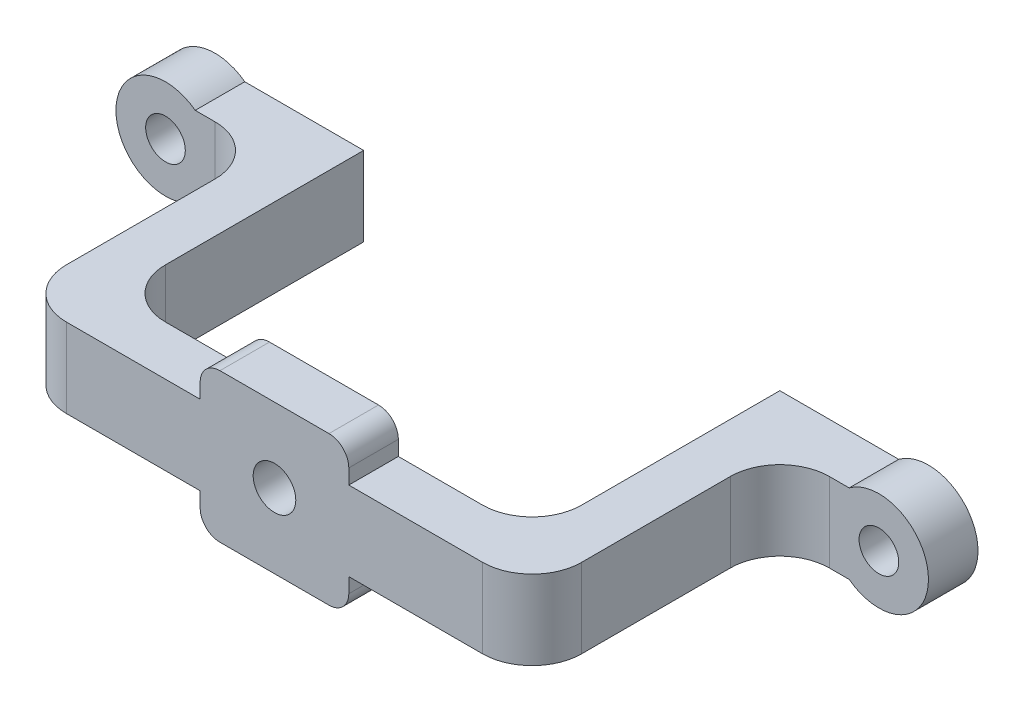
ISO-10303-21;
HEADER;
FILE_DESCRIPTION(('STEP AP214'),'2;1');
FILE_NAME('part.step','',(''),(''),'','','');
FILE_SCHEMA(('AUTOMOTIVE_DESIGN { 1 0 10303 214 1 1 1 1 }'));
ENDSEC;
DATA;
#1=APPLICATION_CONTEXT('core data for automotive mechanical design processes');
#2=APPLICATION_PROTOCOL_DEFINITION('international standard','automotive_design',2000,#1);
#3=PRODUCT_CONTEXT('',#1,'mechanical');
#4=PRODUCT('Part','Part','',(#3));
#5=PRODUCT_RELATED_PRODUCT_CATEGORY('part','',(#4));
#6=PRODUCT_DEFINITION_FORMATION('','',#4);
#7=PRODUCT_DEFINITION_CONTEXT('part definition',#1,'design');
#8=PRODUCT_DEFINITION('design','',#6,#7);
#9=PRODUCT_DEFINITION_SHAPE('','',#8);
#10=(LENGTH_UNIT() NAMED_UNIT(*) SI_UNIT(.MILLI.,.METRE.));
#11=(NAMED_UNIT(*) PLANE_ANGLE_UNIT() SI_UNIT($,.RADIAN.));
#12=(NAMED_UNIT(*) SI_UNIT($,.STERADIAN.) SOLID_ANGLE_UNIT());
#13=UNCERTAINTY_MEASURE_WITH_UNIT(LENGTH_MEASURE(1.E-05),#10,'distance_accuracy_value','');
#14=(GEOMETRIC_REPRESENTATION_CONTEXT(3) GLOBAL_UNCERTAINTY_ASSIGNED_CONTEXT((#13)) GLOBAL_UNIT_ASSIGNED_CONTEXT((#10,
#11,#12)) REPRESENTATION_CONTEXT('',''));
#15=CARTESIAN_POINT('',(0.,0.,0.));
#16=DIRECTION('',(0.,0.,1.));
#17=DIRECTION('',(1.,0.,0.));
#18=AXIS2_PLACEMENT_3D('',#15,#16,#17);
#19=CARTESIAN_POINT('',(15.,4.,0.));
#20=DIRECTION('',(0.,-1.,0.));
#21=DIRECTION('',(0.,0.,-1.));
#22=AXIS2_PLACEMENT_3D('',#19,#20,#21);
#23=PLANE('',#22);
#24=DIRECTION('',(0.,0.,-1.));
#25=VECTOR('',#24,1.);
#26=CARTESIAN_POINT('',(10.,4.,30.));
#27=LINE('',#26,#25);
#28=CARTESIAN_POINT('',(10.,4.,25.));
#29=VERTEX_POINT('',#28);
#30=CARTESIAN_POINT('',(10.,4.,10.));
#31=VERTEX_POINT('',#30);
#32=EDGE_CURVE('E326',#29,#31,#27,.T.);
#33=ORIENTED_EDGE('',*,*,#32,.F.);
#34=CARTESIAN_POINT('',(15.,3.99999999999999,25.));
#35=DIRECTION('',(0.,-1.,0.));
#36=DIRECTION('',(0.,0.,-1.));
#37=AXIS2_PLACEMENT_3D('',#34,#35,#36);
#38=CIRCLE('',#37,5.);
#39=CARTESIAN_POINT('',(15.,4.,30.));
#40=VERTEX_POINT('',#39);
#41=EDGE_CURVE('E429',#29,#40,#38,.F.);
#42=ORIENTED_EDGE('',*,*,#41,.T.);
#43=DIRECTION('',(-1.,0.,0.));
#44=VECTOR('',#43,1.);
#45=CARTESIAN_POINT('',(15.,4.,30.));
#46=LINE('',#45,#44);
#47=CARTESIAN_POINT('',(28.5,4.,30.));
#48=VERTEX_POINT('',#47);
#49=EDGE_CURVE('E242',#48,#40,#46,.T.);
#50=ORIENTED_EDGE('',*,*,#49,.F.);
#51=DIRECTION('',(0.,0.,-1.));
#52=VECTOR('',#51,1.);
#53=CARTESIAN_POINT('',(28.5,4.,0.));
#54=LINE('',#53,#52);
#55=CARTESIAN_POINT('',(28.5,4.,25.));
#56=VERTEX_POINT('',#55);
#57=EDGE_CURVE('E273',#48,#56,#54,.T.);
#58=ORIENTED_EDGE('',*,*,#57,.T.);
#59=DIRECTION('',(-1.,0.,0.));
#60=VECTOR('',#59,1.);
#61=CARTESIAN_POINT('',(36.,4.,25.));
#62=LINE('',#61,#60);
#63=CARTESIAN_POINT('',(20.,4.,25.));
#64=VERTEX_POINT('',#63);
#65=EDGE_CURVE('E312',#56,#64,#62,.T.);
#66=ORIENTED_EDGE('',*,*,#65,.T.);
#67=CARTESIAN_POINT('',(20.,3.99999999999999,20.));
#68=DIRECTION('',(0.,-1.,0.));
#69=DIRECTION('',(0.,0.,-1.));
#70=AXIS2_PLACEMENT_3D('',#67,#68,#69);
#71=CIRCLE('',#70,5.);
#72=CARTESIAN_POINT('',(15.,3.99999999999999,20.));
#73=VERTEX_POINT('',#72);
#74=EDGE_CURVE('E44',#64,#73,#71,.T.);
#75=ORIENTED_EDGE('',*,*,#74,.T.);
#76=DIRECTION('',(0.,0.,1.));
#77=VECTOR('',#76,1.);
#78=CARTESIAN_POINT('',(15.,4.,0.));
#79=LINE('',#78,#77);
#80=CARTESIAN_POINT('',(15.,4.,0.));
#81=VERTEX_POINT('',#80);
#82=EDGE_CURVE('E336',#81,#73,#79,.T.);
#83=ORIENTED_EDGE('',*,*,#82,.F.);
#84=DIRECTION('',(-1.,0.,0.));
#85=VECTOR('',#84,1.);
#86=CARTESIAN_POINT('',(15.,4.,0.));
#87=LINE('',#86,#85);
#88=CARTESIAN_POINT('',(3.,4.,0.));
#89=VERTEX_POINT('',#88);
#90=EDGE_CURVE('E347',#81,#89,#87,.T.);
#91=ORIENTED_EDGE('',*,*,#90,.T.);
#92=DIRECTION('',(0.,0.,-1.));
#93=VECTOR('',#92,1.);
#94=CARTESIAN_POINT('',(3.,4.,5.));
#95=LINE('',#94,#93);
#96=CARTESIAN_POINT('',(3.,4.,5.));
#97=VERTEX_POINT('',#96);
#98=EDGE_CURVE('E353',#89,#97,#95,.F.);
#99=ORIENTED_EDGE('',*,*,#98,.T.);
#100=DIRECTION('',(-1.,0.,0.));
#101=VECTOR('',#100,1.);
#102=CARTESIAN_POINT('',(15.,4.,5.));
#103=LINE('',#102,#101);
#104=CARTESIAN_POINT('',(5.,4.,5.));
#105=VERTEX_POINT('',#104);
#106=EDGE_CURVE('E345',#105,#97,#103,.T.);
#107=ORIENTED_EDGE('',*,*,#106,.F.);
#108=CARTESIAN_POINT('',(5.,4.,10.));
#109=DIRECTION('',(0.,-1.,0.));
#110=DIRECTION('',(0.,0.,-1.));
#111=AXIS2_PLACEMENT_3D('',#108,#109,#110);
#112=CIRCLE('',#111,5.);
#113=EDGE_CURVE('E441',#105,#31,#112,.T.);
#114=ORIENTED_EDGE('',*,*,#113,.T.);
#115=EDGE_LOOP('',(#33,#42,#50,#58,#66,#75,#83,#91,#99,#107,#114));
#116=FACE_BOUND('',#115,.T.);
#117=ADVANCED_FACE('F36',(#116),#23,.F.);
#118=CARTESIAN_POINT('',(15.,-4.,0.));
#119=DIRECTION('',(0.,1.,0.));
#120=DIRECTION('',(0.,0.,1.));
#121=AXIS2_PLACEMENT_3D('',#118,#119,#120);
#122=PLANE('',#121);
#123=DIRECTION('',(1.,0.,0.));
#124=VECTOR('',#123,1.);
#125=CARTESIAN_POINT('',(15.,-4.,30.));
#126=LINE('',#125,#124);
#127=CARTESIAN_POINT('',(15.,-4.,30.));
#128=VERTEX_POINT('',#127);
#129=CARTESIAN_POINT('',(28.5,-4.,30.));
#130=VERTEX_POINT('',#129);
#131=EDGE_CURVE('E321',#128,#130,#126,.T.);
#132=ORIENTED_EDGE('',*,*,#131,.F.);
#133=CARTESIAN_POINT('',(15.,-4.00000000000001,25.));
#134=DIRECTION('',(0.,1.,0.));
#135=DIRECTION('',(0.,0.,1.));
#136=AXIS2_PLACEMENT_3D('',#133,#134,#135);
#137=CIRCLE('',#136,5.);
#138=CARTESIAN_POINT('',(10.,-4.,25.));
#139=VERTEX_POINT('',#138);
#140=EDGE_CURVE('E427',#128,#139,#137,.F.);
#141=ORIENTED_EDGE('',*,*,#140,.T.);
#142=DIRECTION('',(0.,0.,-1.));
#143=VECTOR('',#142,1.);
#144=CARTESIAN_POINT('',(10.,-4.,30.));
#145=LINE('',#144,#143);
#146=CARTESIAN_POINT('',(10.,-4.,10.));
#147=VERTEX_POINT('',#146);
#148=EDGE_CURVE('E323',#139,#147,#145,.T.);
#149=ORIENTED_EDGE('',*,*,#148,.T.);
#150=CARTESIAN_POINT('',(5.,-4.,10.));
#151=DIRECTION('',(0.,1.,0.));
#152=DIRECTION('',(0.,0.,1.));
#153=AXIS2_PLACEMENT_3D('',#150,#151,#152);
#154=CIRCLE('',#153,5.);
#155=CARTESIAN_POINT('',(5.,-4.,5.));
#156=VERTEX_POINT('',#155);
#157=EDGE_CURVE('E439',#147,#156,#154,.T.);
#158=ORIENTED_EDGE('',*,*,#157,.T.);
#159=DIRECTION('',(-1.,0.,0.));
#160=VECTOR('',#159,1.);
#161=CARTESIAN_POINT('',(15.,-4.,5.));
#162=LINE('',#161,#160);
#163=CARTESIAN_POINT('',(3.,-4.,5.));
#164=VERTEX_POINT('',#163);
#165=EDGE_CURVE('E343',#156,#164,#162,.T.);
#166=ORIENTED_EDGE('',*,*,#165,.T.);
#167=DIRECTION('',(0.,0.,-1.));
#168=VECTOR('',#167,1.);
#169=CARTESIAN_POINT('',(3.,-4.,5.));
#170=LINE('',#169,#168);
#171=CARTESIAN_POINT('',(3.,-4.,0.));
#172=VERTEX_POINT('',#171);
#173=EDGE_CURVE('E350',#164,#172,#170,.T.);
#174=ORIENTED_EDGE('',*,*,#173,.T.);
#175=DIRECTION('',(-1.,0.,0.));
#176=VECTOR('',#175,1.);
#177=CARTESIAN_POINT('',(15.,-4.,0.));
#178=LINE('',#177,#176);
#179=CARTESIAN_POINT('',(15.,-4.,0.));
#180=VERTEX_POINT('',#179);
#181=EDGE_CURVE('E340',#180,#172,#178,.T.);
#182=ORIENTED_EDGE('',*,*,#181,.F.);
#183=DIRECTION('',(0.,0.,-1.));
#184=VECTOR('',#183,1.);
#185=CARTESIAN_POINT('',(15.,-4.,0.));
#186=LINE('',#185,#184);
#187=CARTESIAN_POINT('',(15.,-4.,20.));
#188=VERTEX_POINT('',#187);
#189=EDGE_CURVE('E338',#188,#180,#186,.T.);
#190=ORIENTED_EDGE('',*,*,#189,.F.);
#191=CARTESIAN_POINT('',(20.,-4.00000000000001,20.));
#192=DIRECTION('',(0.,1.,0.));
#193=DIRECTION('',(0.,0.,1.));
#194=AXIS2_PLACEMENT_3D('',#191,#192,#193);
#195=CIRCLE('',#194,5.);
#196=CARTESIAN_POINT('',(20.,-4.,25.));
#197=VERTEX_POINT('',#196);
#198=EDGE_CURVE('E11',#188,#197,#195,.T.);
#199=ORIENTED_EDGE('',*,*,#198,.T.);
#200=DIRECTION('',(-1.,0.,0.));
#201=VECTOR('',#200,1.);
#202=CARTESIAN_POINT('',(36.,-4.,25.));
#203=LINE('',#202,#201);
#204=CARTESIAN_POINT('',(28.5,-4.,25.));
#205=VERTEX_POINT('',#204);
#206=EDGE_CURVE('E243',#205,#197,#203,.T.);
#207=ORIENTED_EDGE('',*,*,#206,.F.);
#208=DIRECTION('',(0.,0.,1.));
#209=VECTOR('',#208,1.);
#210=CARTESIAN_POINT('',(28.5,-4.,0.));
#211=LINE('',#210,#209);
#212=EDGE_CURVE('E264',#205,#130,#211,.T.);
#213=ORIENTED_EDGE('',*,*,#212,.T.);
#214=EDGE_LOOP('',(#132,#141,#149,#158,#166,#174,#182,#190,#199,#207,#213));
#215=FACE_BOUND('',#214,.T.);
#216=ADVANCED_FACE('F515',(#215),#122,.F.);
#217=CARTESIAN_POINT('',(15.,0.,0.));
#218=DIRECTION('',(-1.,0.,0.));
#219=DIRECTION('',(0.,0.,1.));
#220=AXIS2_PLACEMENT_3D('',#217,#218,#219);
#221=PLANE('',#220);
#222=ORIENTED_EDGE('',*,*,#82,.T.);
#223=DIRECTION('',(0.,1.,0.));
#224=VECTOR('',#223,1.);
#225=CARTESIAN_POINT('',(15.,-4.00000000000001,20.));
#226=LINE('',#225,#224);
#227=EDGE_CURVE('E437',#73,#188,#226,.F.);
#228=ORIENTED_EDGE('',*,*,#227,.T.);
#229=ORIENTED_EDGE('',*,*,#189,.T.);
#230=DIRECTION('',(0.,1.,0.));
#231=VECTOR('',#230,1.);
#232=CARTESIAN_POINT('',(15.,4.,0.));
#233=LINE('',#232,#231);
#234=EDGE_CURVE('E333',#180,#81,#233,.T.);
#235=ORIENTED_EDGE('',*,*,#234,.T.);
#236=EDGE_LOOP('',(#222,#228,#229,#235));
#237=FACE_BOUND('',#236,.T.);
#238=ADVANCED_FACE('F520',(#237),#221,.F.);
#239=CARTESIAN_POINT('',(0.,0.,5.));
#240=DIRECTION('',(0.,0.,-1.));
#241=DIRECTION('',(-1.,0.,0.));
#242=AXIS2_PLACEMENT_3D('',#239,#240,#241);
#243=CYLINDRICAL_SURFACE('',#242,5.);
#244=ORIENTED_EDGE('',*,*,#98,.F.);
#245=CARTESIAN_POINT('',(0.,0.,0.));
#246=DIRECTION('',(0.,0.,1.));
#247=DIRECTION('',(1.,0.,0.));
#248=AXIS2_PLACEMENT_3D('',#245,#246,#247);
#249=CIRCLE('',#248,5.);
#250=EDGE_CURVE('E356',#89,#172,#249,.T.);
#251=ORIENTED_EDGE('',*,*,#250,.T.);
#252=ORIENTED_EDGE('',*,*,#173,.F.);
#253=CARTESIAN_POINT('',(0.,0.,5.));
#254=DIRECTION('',(0.,0.,1.));
#255=DIRECTION('',(1.,0.,0.));
#256=AXIS2_PLACEMENT_3D('',#253,#254,#255);
#257=CIRCLE('',#256,5.);
#258=EDGE_CURVE('E357',#97,#164,#257,.T.);
#259=ORIENTED_EDGE('',*,*,#258,.F.);
#260=EDGE_LOOP('',(#244,#251,#252,#259));
#261=FACE_BOUND('',#260,.T.);
#262=ADVANCED_FACE('F538',(#261),#243,.T.);
#263=CARTESIAN_POINT('',(0.,0.,5.));
#264=DIRECTION('',(0.,0.,1.));
#265=DIRECTION('',(1.,0.,0.));
#266=AXIS2_PLACEMENT_3D('',#263,#264,#265);
#267=PLANE('',#266);
#268=ORIENTED_EDGE('',*,*,#165,.F.);
#269=DIRECTION('',(0.,-1.,0.));
#270=VECTOR('',#269,1.);
#271=CARTESIAN_POINT('',(5.,0.,5.));
#272=LINE('',#271,#270);
#273=EDGE_CURVE('E408',#156,#105,#272,.F.);
#274=ORIENTED_EDGE('',*,*,#273,.T.);
#275=ORIENTED_EDGE('',*,*,#106,.T.);
#276=ORIENTED_EDGE('',*,*,#258,.T.);
#277=EDGE_LOOP('',(#268,#274,#275,#276));
#278=FACE_BOUND('',#277,.T.);
#279=CARTESIAN_POINT('',(0.,0.,5.));
#280=DIRECTION('',(0.,0.,1.));
#281=DIRECTION('',(1.,0.,0.));
#282=AXIS2_PLACEMENT_3D('',#279,#280,#281);
#283=CIRCLE('',#282,2.);
#284=CARTESIAN_POINT('',(2.,0.,5.));
#285=VERTEX_POINT('',#284);
#286=EDGE_CURVE('E329',#285,#285,#283,.T.);
#287=ORIENTED_EDGE('',*,*,#286,.F.);
#288=EDGE_LOOP('',(#287));
#289=FACE_BOUND('',#288,.T.);
#290=ADVANCED_FACE('F532',(#278,#289),#267,.T.);
#291=CARTESIAN_POINT('',(0.,0.,0.));
#292=DIRECTION('',(0.,0.,1.));
#293=DIRECTION('',(1.,0.,0.));
#294=AXIS2_PLACEMENT_3D('',#291,#292,#293);
#295=PLANE('',#294);
#296=CARTESIAN_POINT('',(0.,0.,0.));
#297=DIRECTION('',(0.,0.,1.));
#298=DIRECTION('',(1.,0.,0.));
#299=AXIS2_PLACEMENT_3D('',#296,#297,#298);
#300=CIRCLE('',#299,2.);
#301=CARTESIAN_POINT('',(2.,0.,0.));
#302=VERTEX_POINT('',#301);
#303=EDGE_CURVE('E332',#302,#302,#300,.T.);
#304=ORIENTED_EDGE('',*,*,#303,.T.);
#305=EDGE_LOOP('',(#304));
#306=FACE_BOUND('',#305,.T.);
#307=ORIENTED_EDGE('',*,*,#250,.F.);
#308=ORIENTED_EDGE('',*,*,#90,.F.);
#309=ORIENTED_EDGE('',*,*,#234,.F.);
#310=ORIENTED_EDGE('',*,*,#181,.T.);
#311=EDGE_LOOP('',(#307,#308,#309,#310));
#312=FACE_BOUND('',#311,.T.);
#313=ADVANCED_FACE('F526',(#306,#312),#295,.F.);
#314=CARTESIAN_POINT('',(57.,4.00000000000001,30.));
#315=VERTEX_POINT('',#314);
#316=CARTESIAN_POINT('',(43.5,4.00000000000001,30.));
#317=VERTEX_POINT('',#316);
#318=EDGE_CURVE('E319',#315,#317,#46,.T.);
#319=ORIENTED_EDGE('',*,*,#318,.F.);
#320=CARTESIAN_POINT('',(57.,3.99999999999999,25.));
#321=DIRECTION('',(0.,-1.,0.));
#322=DIRECTION('',(0.,0.,-1.));
#323=AXIS2_PLACEMENT_3D('',#320,#321,#322);
#324=CIRCLE('',#323,5.);
#325=CARTESIAN_POINT('',(62.,4.,25.));
#326=VERTEX_POINT('',#325);
#327=EDGE_CURVE('E425',#315,#326,#324,.F.);
#328=ORIENTED_EDGE('',*,*,#327,.T.);
#329=DIRECTION('',(0.,0.,-1.));
#330=VECTOR('',#329,1.);
#331=CARTESIAN_POINT('',(62.,4.,30.));
#332=LINE('',#331,#330);
#333=CARTESIAN_POINT('',(62.,4.,10.));
#334=VERTEX_POINT('',#333);
#335=EDGE_CURVE('E279',#326,#334,#332,.T.);
#336=ORIENTED_EDGE('',*,*,#335,.T.);
#337=CARTESIAN_POINT('',(67.,4.,10.));
#338=DIRECTION('',(0.,-1.,0.));
#339=DIRECTION('',(0.,0.,-1.));
#340=AXIS2_PLACEMENT_3D('',#337,#338,#339);
#341=CIRCLE('',#340,5.);
#342=CARTESIAN_POINT('',(67.,4.,5.));
#343=VERTEX_POINT('',#342);
#344=EDGE_CURVE('E445',#334,#343,#341,.T.);
#345=ORIENTED_EDGE('',*,*,#344,.T.);
#346=DIRECTION('',(1.,0.,0.));
#347=VECTOR('',#346,1.);
#348=CARTESIAN_POINT('',(57.,4.,5.));
#349=LINE('',#348,#347);
#350=CARTESIAN_POINT('',(69.,4.,5.));
#351=VERTEX_POINT('',#350);
#352=EDGE_CURVE('E298',#343,#351,#349,.T.);
#353=ORIENTED_EDGE('',*,*,#352,.T.);
#354=DIRECTION('',(0.,0.,-1.));
#355=VECTOR('',#354,1.);
#356=CARTESIAN_POINT('',(69.,4.,5.));
#357=LINE('',#356,#355);
#358=CARTESIAN_POINT('',(69.,4.,0.));
#359=VERTEX_POINT('',#358);
#360=EDGE_CURVE('E305',#359,#351,#357,.F.);
#361=ORIENTED_EDGE('',*,*,#360,.F.);
#362=DIRECTION('',(1.,0.,0.));
#363=VECTOR('',#362,1.);
#364=CARTESIAN_POINT('',(57.,4.,0.));
#365=LINE('',#364,#363);
#366=CARTESIAN_POINT('',(57.,4.,0.));
#367=VERTEX_POINT('',#366);
#368=EDGE_CURVE('E300',#367,#359,#365,.T.);
#369=ORIENTED_EDGE('',*,*,#368,.F.);
#370=DIRECTION('',(0.,0.,1.));
#371=VECTOR('',#370,1.);
#372=CARTESIAN_POINT('',(57.,4.,0.));
#373=LINE('',#372,#371);
#374=CARTESIAN_POINT('',(57.,3.99999999999999,20.));
#375=VERTEX_POINT('',#374);
#376=EDGE_CURVE('E289',#367,#375,#373,.T.);
#377=ORIENTED_EDGE('',*,*,#376,.T.);
#378=CARTESIAN_POINT('',(52.,3.99999999999999,20.));
#379=DIRECTION('',(0.,-1.,0.));
#380=DIRECTION('',(0.,0.,-1.));
#381=AXIS2_PLACEMENT_3D('',#378,#379,#380);
#382=CIRCLE('',#381,5.);
#383=CARTESIAN_POINT('',(52.,4.,25.));
#384=VERTEX_POINT('',#383);
#385=EDGE_CURVE('E447',#375,#384,#382,.T.);
#386=ORIENTED_EDGE('',*,*,#385,.T.);
#387=CARTESIAN_POINT('',(43.5,4.,25.));
#388=VERTEX_POINT('',#387);
#389=EDGE_CURVE('E317',#384,#388,#62,.T.);
#390=ORIENTED_EDGE('',*,*,#389,.T.);
#391=DIRECTION('',(0.,0.,1.));
#392=VECTOR('',#391,1.);
#393=CARTESIAN_POINT('',(43.5,4.,0.));
#394=LINE('',#393,#392);
#395=EDGE_CURVE('E260',#388,#317,#394,.T.);
#396=ORIENTED_EDGE('',*,*,#395,.T.);
#397=EDGE_LOOP('',(#319,#328,#336,#345,#353,#361,#369,#377,#386,#390,#396));
#398=FACE_BOUND('',#397,.T.);
#399=ADVANCED_FACE('F461',(#398),#23,.F.);
#400=DIRECTION('',(0.,0.,-1.));
#401=VECTOR('',#400,1.);
#402=CARTESIAN_POINT('',(62.,-4.,30.));
#403=LINE('',#402,#401);
#404=CARTESIAN_POINT('',(62.,-4.,25.));
#405=VERTEX_POINT('',#404);
#406=CARTESIAN_POINT('',(62.,-4.,10.));
#407=VERTEX_POINT('',#406);
#408=EDGE_CURVE('E276',#405,#407,#403,.T.);
#409=ORIENTED_EDGE('',*,*,#408,.F.);
#410=CARTESIAN_POINT('',(57.,-4.00000000000001,25.));
#411=DIRECTION('',(0.,1.,0.));
#412=DIRECTION('',(0.,0.,1.));
#413=AXIS2_PLACEMENT_3D('',#410,#411,#412);
#414=CIRCLE('',#413,5.);
#415=CARTESIAN_POINT('',(57.,-4.,30.));
#416=VERTEX_POINT('',#415);
#417=EDGE_CURVE('E418',#405,#416,#414,.F.);
#418=ORIENTED_EDGE('',*,*,#417,.T.);
#419=CARTESIAN_POINT('',(43.5,-4.,30.));
#420=VERTEX_POINT('',#419);
#421=EDGE_CURVE('E259',#420,#416,#126,.T.);
#422=ORIENTED_EDGE('',*,*,#421,.F.);
#423=DIRECTION('',(0.,0.,-1.));
#424=VECTOR('',#423,1.);
#425=CARTESIAN_POINT('',(43.5,-4.,0.));
#426=LINE('',#425,#424);
#427=CARTESIAN_POINT('',(43.5,-4.00000000000001,25.));
#428=VERTEX_POINT('',#427);
#429=EDGE_CURVE('E249',#420,#428,#426,.T.);
#430=ORIENTED_EDGE('',*,*,#429,.T.);
#431=CARTESIAN_POINT('',(52.,-4.,25.));
#432=VERTEX_POINT('',#431);
#433=EDGE_CURVE('E231',#432,#428,#203,.T.);
#434=ORIENTED_EDGE('',*,*,#433,.F.);
#435=CARTESIAN_POINT('',(52.,-4.,20.));
#436=DIRECTION('',(0.,1.,0.));
#437=DIRECTION('',(0.,0.,1.));
#438=AXIS2_PLACEMENT_3D('',#435,#436,#437);
#439=CIRCLE('',#438,5.);
#440=CARTESIAN_POINT('',(57.,-4.,20.));
#441=VERTEX_POINT('',#440);
#442=EDGE_CURVE('E449',#432,#441,#439,.T.);
#443=ORIENTED_EDGE('',*,*,#442,.T.);
#444=DIRECTION('',(0.,0.,-1.));
#445=VECTOR('',#444,1.);
#446=CARTESIAN_POINT('',(57.,-4.,0.));
#447=LINE('',#446,#445);
#448=CARTESIAN_POINT('',(57.,-4.,0.));
#449=VERTEX_POINT('',#448);
#450=EDGE_CURVE('E292',#441,#449,#447,.T.);
#451=ORIENTED_EDGE('',*,*,#450,.T.);
#452=DIRECTION('',(1.,0.,0.));
#453=VECTOR('',#452,1.);
#454=CARTESIAN_POINT('',(57.,-4.,0.));
#455=LINE('',#454,#453);
#456=CARTESIAN_POINT('',(69.,-4.,0.));
#457=VERTEX_POINT('',#456);
#458=EDGE_CURVE('E294',#449,#457,#455,.T.);
#459=ORIENTED_EDGE('',*,*,#458,.T.);
#460=DIRECTION('',(0.,0.,-1.));
#461=VECTOR('',#460,1.);
#462=CARTESIAN_POINT('',(69.,-4.,5.));
#463=LINE('',#462,#461);
#464=CARTESIAN_POINT('',(69.,-4.,5.));
#465=VERTEX_POINT('',#464);
#466=EDGE_CURVE('E302',#465,#457,#463,.T.);
#467=ORIENTED_EDGE('',*,*,#466,.F.);
#468=DIRECTION('',(1.,0.,0.));
#469=VECTOR('',#468,1.);
#470=CARTESIAN_POINT('',(57.,-4.,5.));
#471=LINE('',#470,#469);
#472=CARTESIAN_POINT('',(67.,-4.,5.));
#473=VERTEX_POINT('',#472);
#474=EDGE_CURVE('E296',#473,#465,#471,.T.);
#475=ORIENTED_EDGE('',*,*,#474,.F.);
#476=CARTESIAN_POINT('',(67.,-4.,10.));
#477=DIRECTION('',(0.,1.,0.));
#478=DIRECTION('',(0.,0.,1.));
#479=AXIS2_PLACEMENT_3D('',#476,#477,#478);
#480=CIRCLE('',#479,5.);
#481=EDGE_CURVE('E443',#473,#407,#480,.T.);
#482=ORIENTED_EDGE('',*,*,#481,.T.);
#483=EDGE_LOOP('',(#409,#418,#422,#430,#434,#443,#451,#459,#467,#475,#482));
#484=FACE_BOUND('',#483,.T.);
#485=ADVANCED_FACE('F257',(#484),#122,.F.);
#486=CARTESIAN_POINT('',(0.,0.,-25.));
#487=DIRECTION('',(0.,0.,1.));
#488=DIRECTION('',(1.,0.,0.));
#489=AXIS2_PLACEMENT_3D('',#486,#487,#488);
#490=CYLINDRICAL_SURFACE('',#489,2.);
#491=ORIENTED_EDGE('',*,*,#286,.T.);
#492=EDGE_LOOP('',(#491));
#493=FACE_BOUND('',#492,.T.);
#494=ORIENTED_EDGE('',*,*,#303,.F.);
#495=EDGE_LOOP('',(#494));
#496=FACE_BOUND('',#495,.T.);
#497=ADVANCED_FACE('F531',(#493,#496),#490,.F.);
#498=CARTESIAN_POINT('',(10.,4.,30.));
#499=DIRECTION('',(1.,0.,0.));
#500=DIRECTION('',(0.,0.,-1.));
#501=AXIS2_PLACEMENT_3D('',#498,#499,#500);
#502=PLANE('',#501);
#503=ORIENTED_EDGE('',*,*,#32,.T.);
#504=DIRECTION('',(0.,-1.,0.));
#505=VECTOR('',#504,1.);
#506=CARTESIAN_POINT('',(10.,4.,10.));
#507=LINE('',#506,#505);
#508=EDGE_CURVE('E405',#31,#147,#507,.T.);
#509=ORIENTED_EDGE('',*,*,#508,.T.);
#510=ORIENTED_EDGE('',*,*,#148,.F.);
#511=DIRECTION('',(0.,-1.,0.));
#512=VECTOR('',#511,1.);
#513=CARTESIAN_POINT('',(10.,4.,25.));
#514=LINE('',#513,#512);
#515=EDGE_CURVE('E398',#139,#29,#514,.F.);
#516=ORIENTED_EDGE('',*,*,#515,.T.);
#517=EDGE_LOOP('',(#503,#509,#510,#516));
#518=FACE_BOUND('',#517,.T.);
#519=ADVANCED_FACE('F604',(#518),#502,.F.);
#520=CARTESIAN_POINT('',(0.,0.,30.));
#521=DIRECTION('',(0.,0.,-1.));
#522=DIRECTION('',(-1.,0.,0.));
#523=AXIS2_PLACEMENT_3D('',#520,#521,#522);
#524=PLANE('',#523);
#525=CARTESIAN_POINT('',(36.,0.,30.));
#526=DIRECTION('',(0.,0.,1.));
#527=DIRECTION('',(1.,0.,0.));
#528=AXIS2_PLACEMENT_3D('',#525,#526,#527);
#529=CIRCLE('',#528,2.15);
#530=CARTESIAN_POINT('',(38.15,0.,30.));
#531=VERTEX_POINT('',#530);
#532=EDGE_CURVE('E403',#531,#531,#529,.T.);
#533=ORIENTED_EDGE('',*,*,#532,.F.);
#534=EDGE_LOOP('',(#533));
#535=FACE_BOUND('',#534,.T.);
#536=ORIENTED_EDGE('',*,*,#421,.T.);
#537=DIRECTION('',(0.,-1.,0.));
#538=VECTOR('',#537,1.);
#539=CARTESIAN_POINT('',(57.,0.,30.));
#540=LINE('',#539,#538);
#541=EDGE_CURVE('E423',#416,#315,#540,.F.);
#542=ORIENTED_EDGE('',*,*,#541,.T.);
#543=ORIENTED_EDGE('',*,*,#318,.T.);
#544=DIRECTION('',(0.,1.,0.));
#545=VECTOR('',#544,1.);
#546=CARTESIAN_POINT('',(43.5,7.5,30.));
#547=LINE('',#546,#545);
#548=CARTESIAN_POINT('',(43.5,5.5,30.));
#549=VERTEX_POINT('',#548);
#550=EDGE_CURVE('E473',#317,#549,#547,.T.);
#551=ORIENTED_EDGE('',*,*,#550,.T.);
#552=CARTESIAN_POINT('',(41.5,5.5,30.));
#553=DIRECTION('',(0.,0.,-1.));
#554=DIRECTION('',(-1.,0.,0.));
#555=AXIS2_PLACEMENT_3D('',#552,#553,#554);
#556=CIRCLE('',#555,2.);
#557=CARTESIAN_POINT('',(41.5,7.5,30.));
#558=VERTEX_POINT('',#557);
#559=EDGE_CURVE('E368',#549,#558,#556,.F.);
#560=ORIENTED_EDGE('',*,*,#559,.T.);
#561=DIRECTION('',(-1.,0.,0.));
#562=VECTOR('',#561,1.);
#563=CARTESIAN_POINT('',(28.5,7.5,30.));
#564=LINE('',#563,#562);
#565=CARTESIAN_POINT('',(30.5,7.5,30.));
#566=VERTEX_POINT('',#565);
#567=EDGE_CURVE('E254',#558,#566,#564,.T.);
#568=ORIENTED_EDGE('',*,*,#567,.T.);
#569=CARTESIAN_POINT('',(30.5,5.5,30.));
#570=DIRECTION('',(0.,0.,-1.));
#571=DIRECTION('',(-1.,0.,0.));
#572=AXIS2_PLACEMENT_3D('',#569,#570,#571);
#573=CIRCLE('',#572,2.);
#574=CARTESIAN_POINT('',(28.5,5.5,30.));
#575=VERTEX_POINT('',#574);
#576=EDGE_CURVE('E370',#566,#575,#573,.F.);
#577=ORIENTED_EDGE('',*,*,#576,.T.);
#578=DIRECTION('',(0.,-1.,0.));
#579=VECTOR('',#578,1.);
#580=CARTESIAN_POINT('',(28.5,7.5,30.));
#581=LINE('',#580,#579);
#582=EDGE_CURVE('E666',#575,#48,#581,.T.);
#583=ORIENTED_EDGE('',*,*,#582,.T.);
#584=ORIENTED_EDGE('',*,*,#49,.T.);
#585=DIRECTION('',(0.,-1.,0.));
#586=VECTOR('',#585,1.);
#587=CARTESIAN_POINT('',(15.,0.,30.));
#588=LINE('',#587,#586);
#589=EDGE_CURVE('E420',#40,#128,#588,.T.);
#590=ORIENTED_EDGE('',*,*,#589,.T.);
#591=ORIENTED_EDGE('',*,*,#131,.T.);
#592=CARTESIAN_POINT('',(28.5,-5.5,30.));
#593=VERTEX_POINT('',#592);
#594=EDGE_CURVE('E402',#130,#593,#581,.T.);
#595=ORIENTED_EDGE('',*,*,#594,.T.);
#596=CARTESIAN_POINT('',(30.5,-5.5,30.));
#597=DIRECTION('',(0.,0.,-1.));
#598=DIRECTION('',(-1.,0.,0.));
#599=AXIS2_PLACEMENT_3D('',#596,#597,#598);
#600=CIRCLE('',#599,2.);
#601=CARTESIAN_POINT('',(30.5,-7.5,30.));
#602=VERTEX_POINT('',#601);
#603=EDGE_CURVE('E372',#593,#602,#600,.F.);
#604=ORIENTED_EDGE('',*,*,#603,.T.);
#605=DIRECTION('',(1.,0.,0.));
#606=VECTOR('',#605,1.);
#607=CARTESIAN_POINT('',(28.5,-7.5,30.));
#608=LINE('',#607,#606);
#609=CARTESIAN_POINT('',(41.5,-7.5,30.));
#610=VERTEX_POINT('',#609);
#611=EDGE_CURVE('E668',#602,#610,#608,.T.);
#612=ORIENTED_EDGE('',*,*,#611,.T.);
#613=CARTESIAN_POINT('',(41.5,-5.5,30.));
#614=DIRECTION('',(0.,0.,-1.));
#615=DIRECTION('',(-1.,0.,0.));
#616=AXIS2_PLACEMENT_3D('',#613,#614,#615);
#617=CIRCLE('',#616,2.);
#618=CARTESIAN_POINT('',(43.5,-5.5,30.));
#619=VERTEX_POINT('',#618);
#620=EDGE_CURVE('E374',#610,#619,#617,.F.);
#621=ORIENTED_EDGE('',*,*,#620,.T.);
#622=EDGE_CURVE('E671',#619,#420,#547,.T.);
#623=ORIENTED_EDGE('',*,*,#622,.T.);
#624=EDGE_LOOP('',(#536,#542,#543,#551,#560,#568,#577,#583,#584,#590,#591,#595,#604,#612,#621,#623));
#625=FACE_BOUND('',#624,.T.);
#626=ADVANCED_FACE('F597',(#535,#625),#524,.F.);
#627=CARTESIAN_POINT('',(36.,4.,25.));
#628=DIRECTION('',(0.,0.,1.));
#629=DIRECTION('',(1.,0.,0.));
#630=AXIS2_PLACEMENT_3D('',#627,#628,#629);
#631=PLANE('',#630);
#632=CARTESIAN_POINT('',(36.,0.,25.));
#633=DIRECTION('',(0.,0.,1.));
#634=DIRECTION('',(1.,0.,0.));
#635=AXIS2_PLACEMENT_3D('',#632,#633,#634);
#636=CIRCLE('',#635,2.15);
#637=CARTESIAN_POINT('',(38.15,0.,25.));
#638=VERTEX_POINT('',#637);
#639=EDGE_CURVE('E399',#638,#638,#636,.T.);
#640=ORIENTED_EDGE('',*,*,#639,.T.);
#641=EDGE_LOOP('',(#640));
#642=FACE_BOUND('',#641,.T.);
#643=ORIENTED_EDGE('',*,*,#389,.F.);
#644=DIRECTION('',(0.,1.,0.));
#645=VECTOR('',#644,1.);
#646=CARTESIAN_POINT('',(52.,-4.00000000000001,25.));
#647=LINE('',#646,#645);
#648=EDGE_CURVE('E238',#384,#432,#647,.F.);
#649=ORIENTED_EDGE('',*,*,#648,.T.);
#650=ORIENTED_EDGE('',*,*,#433,.T.);
#651=DIRECTION('',(0.,-1.,0.));
#652=VECTOR('',#651,1.);
#653=CARTESIAN_POINT('',(43.5,7.5,25.));
#654=LINE('',#653,#652);
#655=CARTESIAN_POINT('',(43.5,-5.5,25.));
#656=VERTEX_POINT('',#655);
#657=EDGE_CURVE('E235',#428,#656,#654,.T.);
#658=ORIENTED_EDGE('',*,*,#657,.T.);
#659=CARTESIAN_POINT('',(41.5,-5.5,25.));
#660=DIRECTION('',(0.,0.,1.));
#661=DIRECTION('',(1.,0.,0.));
#662=AXIS2_PLACEMENT_3D('',#659,#660,#661);
#663=CIRCLE('',#662,2.);
#664=CARTESIAN_POINT('',(41.5,-7.5,25.));
#665=VERTEX_POINT('',#664);
#666=EDGE_CURVE('E383',#656,#665,#663,.F.);
#667=ORIENTED_EDGE('',*,*,#666,.T.);
#668=DIRECTION('',(-1.,0.,0.));
#669=VECTOR('',#668,1.);
#670=CARTESIAN_POINT('',(28.5,-7.5,25.));
#671=LINE('',#670,#669);
#672=CARTESIAN_POINT('',(30.5,-7.5,25.));
#673=VERTEX_POINT('',#672);
#674=EDGE_CURVE('E261',#665,#673,#671,.T.);
#675=ORIENTED_EDGE('',*,*,#674,.T.);
#676=CARTESIAN_POINT('',(30.5,-5.5,25.));
#677=DIRECTION('',(0.,0.,1.));
#678=DIRECTION('',(1.,0.,0.));
#679=AXIS2_PLACEMENT_3D('',#676,#677,#678);
#680=CIRCLE('',#679,2.);
#681=CARTESIAN_POINT('',(28.5,-5.5,25.));
#682=VERTEX_POINT('',#681);
#683=EDGE_CURVE('E381',#673,#682,#680,.F.);
#684=ORIENTED_EDGE('',*,*,#683,.T.);
#685=DIRECTION('',(0.,1.,0.));
#686=VECTOR('',#685,1.);
#687=CARTESIAN_POINT('',(28.5,7.5,25.));
#688=LINE('',#687,#686);
#689=EDGE_CURVE('E267',#682,#205,#688,.T.);
#690=ORIENTED_EDGE('',*,*,#689,.T.);
#691=ORIENTED_EDGE('',*,*,#206,.T.);
#692=DIRECTION('',(0.,1.,0.));
#693=VECTOR('',#692,1.);
#694=CARTESIAN_POINT('',(20.,4.,25.));
#695=LINE('',#694,#693);
#696=EDGE_CURVE('E434',#197,#64,#695,.T.);
#697=ORIENTED_EDGE('',*,*,#696,.T.);
#698=ORIENTED_EDGE('',*,*,#65,.F.);
#699=CARTESIAN_POINT('',(28.5,5.5,25.));
#700=VERTEX_POINT('',#699);
#701=EDGE_CURVE('E591',#56,#700,#688,.T.);
#702=ORIENTED_EDGE('',*,*,#701,.T.);
#703=CARTESIAN_POINT('',(30.5,5.5,25.));
#704=DIRECTION('',(0.,0.,1.));
#705=DIRECTION('',(1.,0.,0.));
#706=AXIS2_PLACEMENT_3D('',#703,#704,#705);
#707=CIRCLE('',#706,2.);
#708=CARTESIAN_POINT('',(30.5,7.5,25.));
#709=VERTEX_POINT('',#708);
#710=EDGE_CURVE('E379',#700,#709,#707,.F.);
#711=ORIENTED_EDGE('',*,*,#710,.T.);
#712=DIRECTION('',(1.,0.,0.));
#713=VECTOR('',#712,1.);
#714=CARTESIAN_POINT('',(28.5,7.5,25.));
#715=LINE('',#714,#713);
#716=CARTESIAN_POINT('',(41.5,7.5,25.));
#717=VERTEX_POINT('',#716);
#718=EDGE_CURVE('E469',#709,#717,#715,.T.);
#719=ORIENTED_EDGE('',*,*,#718,.T.);
#720=CARTESIAN_POINT('',(41.5,5.5,25.));
#721=DIRECTION('',(0.,0.,1.));
#722=DIRECTION('',(1.,0.,0.));
#723=AXIS2_PLACEMENT_3D('',#720,#721,#722);
#724=CIRCLE('',#723,2.);
#725=CARTESIAN_POINT('',(43.5,5.5,25.));
#726=VERTEX_POINT('',#725);
#727=EDGE_CURVE('E377',#717,#726,#724,.F.);
#728=ORIENTED_EDGE('',*,*,#727,.T.);
#729=EDGE_CURVE('E253',#726,#388,#654,.T.);
#730=ORIENTED_EDGE('',*,*,#729,.T.);
#731=EDGE_LOOP('',(#643,#649,#650,#658,#667,#675,#684,#690,#691,#697,#698,#702,#711,#719,#728,#730));
#732=FACE_BOUND('',#731,.T.);
#733=ADVANCED_FACE('F234',(#642,#732),#631,.F.);
#734=CARTESIAN_POINT('',(57.,0.,0.));
#735=DIRECTION('',(1.,0.,0.));
#736=DIRECTION('',(0.,0.,1.));
#737=AXIS2_PLACEMENT_3D('',#734,#735,#736);
#738=PLANE('',#737);
#739=ORIENTED_EDGE('',*,*,#450,.F.);
#740=DIRECTION('',(0.,1.,0.));
#741=VECTOR('',#740,1.);
#742=CARTESIAN_POINT('',(57.,4.,20.));
#743=LINE('',#742,#741);
#744=EDGE_CURVE('E431',#441,#375,#743,.T.);
#745=ORIENTED_EDGE('',*,*,#744,.T.);
#746=ORIENTED_EDGE('',*,*,#376,.F.);
#747=DIRECTION('',(0.,1.,0.));
#748=VECTOR('',#747,1.);
#749=CARTESIAN_POINT('',(57.,4.,0.));
#750=LINE('',#749,#748);
#751=EDGE_CURVE('E286',#449,#367,#750,.T.);
#752=ORIENTED_EDGE('',*,*,#751,.F.);
#753=EDGE_LOOP('',(#739,#745,#746,#752));
#754=FACE_BOUND('',#753,.T.);
#755=ADVANCED_FACE('F456',(#754),#738,.F.);
#756=CARTESIAN_POINT('',(72.,0.,5.));
#757=DIRECTION('',(0.,0.,-1.));
#758=DIRECTION('',(1.,0.,0.));
#759=AXIS2_PLACEMENT_3D('',#756,#757,#758);
#760=CYLINDRICAL_SURFACE('',#759,5.);
#761=ORIENTED_EDGE('',*,*,#360,.T.);
#762=CARTESIAN_POINT('',(72.,0.,5.));
#763=DIRECTION('',(0.,0.,-1.));
#764=DIRECTION('',(-1.,0.,0.));
#765=AXIS2_PLACEMENT_3D('',#762,#763,#764);
#766=CIRCLE('',#765,5.);
#767=EDGE_CURVE('E309',#351,#465,#766,.T.);
#768=ORIENTED_EDGE('',*,*,#767,.T.);
#769=ORIENTED_EDGE('',*,*,#466,.T.);
#770=CARTESIAN_POINT('',(72.,0.,0.));
#771=DIRECTION('',(0.,0.,-1.));
#772=DIRECTION('',(-1.,0.,0.));
#773=AXIS2_PLACEMENT_3D('',#770,#771,#772);
#774=CIRCLE('',#773,5.);
#775=EDGE_CURVE('E308',#359,#457,#774,.T.);
#776=ORIENTED_EDGE('',*,*,#775,.F.);
#777=EDGE_LOOP('',(#761,#768,#769,#776));
#778=FACE_BOUND('',#777,.T.);
#779=ADVANCED_FACE('F498',(#778),#760,.T.);
#780=CARTESIAN_POINT('',(72.,0.,5.));
#781=DIRECTION('',(0.,0.,1.));
#782=DIRECTION('',(-1.,0.,0.));
#783=AXIS2_PLACEMENT_3D('',#780,#781,#782);
#784=PLANE('',#783);
#785=ORIENTED_EDGE('',*,*,#352,.F.);
#786=DIRECTION('',(0.,-1.,0.));
#787=VECTOR('',#786,1.);
#788=CARTESIAN_POINT('',(67.,0.,5.));
#789=LINE('',#788,#787);
#790=EDGE_CURVE('E410',#343,#473,#789,.T.);
#791=ORIENTED_EDGE('',*,*,#790,.T.);
#792=ORIENTED_EDGE('',*,*,#474,.T.);
#793=ORIENTED_EDGE('',*,*,#767,.F.);
#794=EDGE_LOOP('',(#785,#791,#792,#793));
#795=FACE_BOUND('',#794,.T.);
#796=CARTESIAN_POINT('',(72.,0.,5.));
#797=DIRECTION('',(0.,0.,-1.));
#798=DIRECTION('',(-1.,0.,0.));
#799=AXIS2_PLACEMENT_3D('',#796,#797,#798);
#800=CIRCLE('',#799,2.);
#801=CARTESIAN_POINT('',(70.,0.,5.));
#802=VERTEX_POINT('',#801);
#803=EDGE_CURVE('E282',#802,#802,#800,.T.);
#804=ORIENTED_EDGE('',*,*,#803,.T.);
#805=EDGE_LOOP('',(#804));
#806=FACE_BOUND('',#805,.T.);
#807=ADVANCED_FACE('F492',(#795,#806),#784,.T.);
#808=CARTESIAN_POINT('',(72.,0.,0.));
#809=DIRECTION('',(0.,0.,1.));
#810=DIRECTION('',(-1.,0.,0.));
#811=AXIS2_PLACEMENT_3D('',#808,#809,#810);
#812=PLANE('',#811);
#813=CARTESIAN_POINT('',(72.,0.,0.));
#814=DIRECTION('',(0.,0.,-1.));
#815=DIRECTION('',(-1.,0.,0.));
#816=AXIS2_PLACEMENT_3D('',#813,#814,#815);
#817=CIRCLE('',#816,2.);
#818=CARTESIAN_POINT('',(70.,0.,0.));
#819=VERTEX_POINT('',#818);
#820=EDGE_CURVE('E285',#819,#819,#817,.T.);
#821=ORIENTED_EDGE('',*,*,#820,.F.);
#822=EDGE_LOOP('',(#821));
#823=FACE_BOUND('',#822,.T.);
#824=ORIENTED_EDGE('',*,*,#775,.T.);
#825=ORIENTED_EDGE('',*,*,#458,.F.);
#826=ORIENTED_EDGE('',*,*,#751,.T.);
#827=ORIENTED_EDGE('',*,*,#368,.T.);
#828=EDGE_LOOP('',(#824,#825,#826,#827));
#829=FACE_BOUND('',#828,.T.);
#830=ADVANCED_FACE('F500',(#823,#829),#812,.F.);
#831=CARTESIAN_POINT('',(72.,0.,-25.));
#832=DIRECTION('',(0.,0.,1.));
#833=DIRECTION('',(-1.,0.,0.));
#834=AXIS2_PLACEMENT_3D('',#831,#832,#833);
#835=CYLINDRICAL_SURFACE('',#834,2.);
#836=ORIENTED_EDGE('',*,*,#803,.F.);
#837=EDGE_LOOP('',(#836));
#838=FACE_BOUND('',#837,.T.);
#839=ORIENTED_EDGE('',*,*,#820,.T.);
#840=EDGE_LOOP('',(#839));
#841=FACE_BOUND('',#840,.T.);
#842=ADVANCED_FACE('F502',(#838,#841),#835,.F.);
#843=CARTESIAN_POINT('',(62.,4.,30.));
#844=DIRECTION('',(-1.,0.,0.));
#845=DIRECTION('',(0.,0.,-1.));
#846=AXIS2_PLACEMENT_3D('',#843,#844,#845);
#847=PLANE('',#846);
#848=ORIENTED_EDGE('',*,*,#408,.T.);
#849=DIRECTION('',(0.,-1.,0.));
#850=VECTOR('',#849,1.);
#851=CARTESIAN_POINT('',(62.,4.,10.));
#852=LINE('',#851,#850);
#853=EDGE_CURVE('E416',#407,#334,#852,.F.);
#854=ORIENTED_EDGE('',*,*,#853,.T.);
#855=ORIENTED_EDGE('',*,*,#335,.F.);
#856=DIRECTION('',(0.,-1.,0.));
#857=VECTOR('',#856,1.);
#858=CARTESIAN_POINT('',(62.,4.,25.));
#859=LINE('',#858,#857);
#860=EDGE_CURVE('E413',#326,#405,#859,.T.);
#861=ORIENTED_EDGE('',*,*,#860,.T.);
#862=EDGE_LOOP('',(#848,#854,#855,#861));
#863=FACE_BOUND('',#862,.T.);
#864=ADVANCED_FACE('F482',(#863),#847,.F.);
#865=CARTESIAN_POINT('',(28.5,-7.5,3.78679656440357));
#866=DIRECTION('',(0.,-1.,0.));
#867=DIRECTION('',(0.,0.,-1.));
#868=AXIS2_PLACEMENT_3D('',#865,#866,#867);
#869=PLANE('',#868);
#870=ORIENTED_EDGE('',*,*,#674,.F.);
#871=DIRECTION('',(0.,0.,1.));
#872=VECTOR('',#871,1.);
#873=CARTESIAN_POINT('',(41.5,-7.5,3.78679656440357));
#874=LINE('',#873,#872);
#875=EDGE_CURVE('E365',#665,#610,#874,.T.);
#876=ORIENTED_EDGE('',*,*,#875,.T.);
#877=ORIENTED_EDGE('',*,*,#611,.F.);
#878=DIRECTION('',(0.,0.,1.));
#879=VECTOR('',#878,1.);
#880=CARTESIAN_POINT('',(30.5,-7.5,3.78679656440357));
#881=LINE('',#880,#879);
#882=EDGE_CURVE('E360',#602,#673,#881,.F.);
#883=ORIENTED_EDGE('',*,*,#882,.T.);
#884=EDGE_LOOP('',(#870,#876,#877,#883));
#885=FACE_BOUND('',#884,.T.);
#886=ADVANCED_FACE('F642',(#885),#869,.T.);
#887=CARTESIAN_POINT('',(43.5,7.5,3.78679656440357));
#888=DIRECTION('',(1.,0.,0.));
#889=DIRECTION('',(0.,0.,-1.));
#890=AXIS2_PLACEMENT_3D('',#887,#888,#889);
#891=PLANE('',#890);
#892=ORIENTED_EDGE('',*,*,#622,.F.);
#893=DIRECTION('',(0.,0.,1.));
#894=VECTOR('',#893,1.);
#895=CARTESIAN_POINT('',(43.5,-5.5,3.78679656440357));
#896=LINE('',#895,#894);
#897=EDGE_CURVE('E252',#619,#656,#896,.F.);
#898=ORIENTED_EDGE('',*,*,#897,.T.);
#899=ORIENTED_EDGE('',*,*,#657,.F.);
#900=ORIENTED_EDGE('',*,*,#429,.F.);
#901=EDGE_LOOP('',(#892,#898,#899,#900));
#902=FACE_BOUND('',#901,.T.);
#903=ADVANCED_FACE('F248',(#902),#891,.T.);
#904=CARTESIAN_POINT('',(28.5,7.5,3.78679656440357));
#905=DIRECTION('',(-1.,0.,0.));
#906=DIRECTION('',(0.,-1.,0.));
#907=AXIS2_PLACEMENT_3D('',#904,#905,#906);
#908=PLANE('',#907);
#909=ORIENTED_EDGE('',*,*,#689,.F.);
#910=DIRECTION('',(0.,0.,1.));
#911=VECTOR('',#910,1.);
#912=CARTESIAN_POINT('',(28.5,-5.5,3.78679656440357));
#913=LINE('',#912,#911);
#914=EDGE_CURVE('E385',#682,#593,#913,.T.);
#915=ORIENTED_EDGE('',*,*,#914,.T.);
#916=ORIENTED_EDGE('',*,*,#594,.F.);
#917=ORIENTED_EDGE('',*,*,#212,.F.);
#918=EDGE_LOOP('',(#909,#915,#916,#917));
#919=FACE_BOUND('',#918,.T.);
#920=ADVANCED_FACE('F594',(#919),#908,.T.);
#921=ORIENTED_EDGE('',*,*,#582,.F.);
#922=DIRECTION('',(0.,0.,1.));
#923=VECTOR('',#922,1.);
#924=CARTESIAN_POINT('',(28.5,5.5,3.78679656440357));
#925=LINE('',#924,#923);
#926=EDGE_CURVE('E393',#575,#700,#925,.F.);
#927=ORIENTED_EDGE('',*,*,#926,.T.);
#928=ORIENTED_EDGE('',*,*,#701,.F.);
#929=ORIENTED_EDGE('',*,*,#57,.F.);
#930=EDGE_LOOP('',(#921,#927,#928,#929));
#931=FACE_BOUND('',#930,.T.);
#932=ADVANCED_FACE('F643',(#931),#908,.T.);
#933=ORIENTED_EDGE('',*,*,#729,.F.);
#934=DIRECTION('',(0.,0.,1.));
#935=VECTOR('',#934,1.);
#936=CARTESIAN_POINT('',(43.5,5.5,3.78679656440357));
#937=LINE('',#936,#935);
#938=EDGE_CURVE('E395',#726,#549,#937,.T.);
#939=ORIENTED_EDGE('',*,*,#938,.T.);
#940=ORIENTED_EDGE('',*,*,#550,.F.);
#941=ORIENTED_EDGE('',*,*,#395,.F.);
#942=EDGE_LOOP('',(#933,#939,#940,#941));
#943=FACE_BOUND('',#942,.T.);
#944=ADVANCED_FACE('F471',(#943),#891,.T.);
#945=CARTESIAN_POINT('',(28.5,7.5,3.78679656440357));
#946=DIRECTION('',(0.,1.,0.));
#947=DIRECTION('',(0.,0.,1.));
#948=AXIS2_PLACEMENT_3D('',#945,#946,#947);
#949=PLANE('',#948);
#950=ORIENTED_EDGE('',*,*,#718,.F.);
#951=DIRECTION('',(0.,0.,1.));
#952=VECTOR('',#951,1.);
#953=CARTESIAN_POINT('',(30.5,7.5,3.78679656440357));
#954=LINE('',#953,#952);
#955=EDGE_CURVE('E390',#709,#566,#954,.T.);
#956=ORIENTED_EDGE('',*,*,#955,.T.);
#957=ORIENTED_EDGE('',*,*,#567,.F.);
#958=DIRECTION('',(0.,0.,1.));
#959=VECTOR('',#958,1.);
#960=CARTESIAN_POINT('',(41.5,7.5,3.78679656440357));
#961=LINE('',#960,#959);
#962=EDGE_CURVE('E388',#558,#717,#961,.F.);
#963=ORIENTED_EDGE('',*,*,#962,.T.);
#964=EDGE_LOOP('',(#950,#956,#957,#963));
#965=FACE_BOUND('',#964,.T.);
#966=ADVANCED_FACE('F549',(#965),#949,.T.);
#967=CARTESIAN_POINT('',(41.5,-5.5,3.78679656440357));
#968=DIRECTION('',(0.,0.,1.));
#969=DIRECTION('',(1.,0.,0.));
#970=AXIS2_PLACEMENT_3D('',#967,#968,#969);
#971=CYLINDRICAL_SURFACE('',#970,2.);
#972=ORIENTED_EDGE('',*,*,#666,.F.);
#973=ORIENTED_EDGE('',*,*,#897,.F.);
#974=ORIENTED_EDGE('',*,*,#620,.F.);
#975=ORIENTED_EDGE('',*,*,#875,.F.);
#976=EDGE_LOOP('',(#972,#973,#974,#975));
#977=FACE_BOUND('',#976,.T.);
#978=ADVANCED_FACE('F545',(#977),#971,.T.);
#979=CARTESIAN_POINT('',(30.5,-5.5,3.78679656440357));
#980=DIRECTION('',(0.,0.,1.));
#981=DIRECTION('',(1.,0.,0.));
#982=AXIS2_PLACEMENT_3D('',#979,#980,#981);
#983=CYLINDRICAL_SURFACE('',#982,2.);
#984=ORIENTED_EDGE('',*,*,#683,.F.);
#985=ORIENTED_EDGE('',*,*,#882,.F.);
#986=ORIENTED_EDGE('',*,*,#603,.F.);
#987=ORIENTED_EDGE('',*,*,#914,.F.);
#988=EDGE_LOOP('',(#984,#985,#986,#987));
#989=FACE_BOUND('',#988,.T.);
#990=ADVANCED_FACE('F548',(#989),#983,.T.);
#991=CARTESIAN_POINT('',(30.5,5.5,3.78679656440357));
#992=DIRECTION('',(0.,0.,1.));
#993=DIRECTION('',(1.,0.,0.));
#994=AXIS2_PLACEMENT_3D('',#991,#992,#993);
#995=CYLINDRICAL_SURFACE('',#994,2.);
#996=ORIENTED_EDGE('',*,*,#710,.F.);
#997=ORIENTED_EDGE('',*,*,#926,.F.);
#998=ORIENTED_EDGE('',*,*,#576,.F.);
#999=ORIENTED_EDGE('',*,*,#955,.F.);
#1000=EDGE_LOOP('',(#996,#997,#998,#999));
#1001=FACE_BOUND('',#1000,.T.);
#1002=ADVANCED_FACE('F553',(#1001),#995,.T.);
#1003=CARTESIAN_POINT('',(41.5,5.5,3.78679656440357));
#1004=DIRECTION('',(0.,0.,1.));
#1005=DIRECTION('',(1.,0.,0.));
#1006=AXIS2_PLACEMENT_3D('',#1003,#1004,#1005);
#1007=CYLINDRICAL_SURFACE('',#1006,2.);
#1008=ORIENTED_EDGE('',*,*,#727,.F.);
#1009=ORIENTED_EDGE('',*,*,#962,.F.);
#1010=ORIENTED_EDGE('',*,*,#559,.F.);
#1011=ORIENTED_EDGE('',*,*,#938,.F.);
#1012=EDGE_LOOP('',(#1008,#1009,#1010,#1011));
#1013=FACE_BOUND('',#1012,.T.);
#1014=ADVANCED_FACE('F557',(#1013),#1007,.T.);
#1015=CARTESIAN_POINT('',(36.,0.,20.));
#1016=DIRECTION('',(0.,0.,1.));
#1017=DIRECTION('',(1.,0.,0.));
#1018=AXIS2_PLACEMENT_3D('',#1015,#1016,#1017);
#1019=CYLINDRICAL_SURFACE('',#1018,2.15);
#1020=ORIENTED_EDGE('',*,*,#532,.T.);
#1021=EDGE_LOOP('',(#1020));
#1022=FACE_BOUND('',#1021,.T.);
#1023=ORIENTED_EDGE('',*,*,#639,.F.);
#1024=EDGE_LOOP('',(#1023));
#1025=FACE_BOUND('',#1024,.T.);
#1026=ADVANCED_FACE('F561',(#1022,#1025),#1019,.F.);
#1027=CARTESIAN_POINT('',(5.,4.,10.));
#1028=DIRECTION('',(0.,-1.,0.));
#1029=DIRECTION('',(0.,0.,-1.));
#1030=AXIS2_PLACEMENT_3D('',#1027,#1028,#1029);
#1031=CYLINDRICAL_SURFACE('',#1030,5.);
#1032=ORIENTED_EDGE('',*,*,#113,.F.);
#1033=ORIENTED_EDGE('',*,*,#273,.F.);
#1034=ORIENTED_EDGE('',*,*,#157,.F.);
#1035=ORIENTED_EDGE('',*,*,#508,.F.);
#1036=EDGE_LOOP('',(#1032,#1033,#1034,#1035));
#1037=FACE_BOUND('',#1036,.T.);
#1038=ADVANCED_FACE('F563',(#1037),#1031,.F.);
#1039=CARTESIAN_POINT('',(67.,0.,10.));
#1040=DIRECTION('',(0.,-1.,0.));
#1041=DIRECTION('',(0.,0.,-1.));
#1042=AXIS2_PLACEMENT_3D('',#1039,#1040,#1041);
#1043=CYLINDRICAL_SURFACE('',#1042,5.);
#1044=ORIENTED_EDGE('',*,*,#344,.F.);
#1045=ORIENTED_EDGE('',*,*,#853,.F.);
#1046=ORIENTED_EDGE('',*,*,#481,.F.);
#1047=ORIENTED_EDGE('',*,*,#790,.F.);
#1048=EDGE_LOOP('',(#1044,#1045,#1046,#1047));
#1049=FACE_BOUND('',#1048,.T.);
#1050=ADVANCED_FACE('F489',(#1049),#1043,.F.);
#1051=CARTESIAN_POINT('',(57.,4.,25.));
#1052=DIRECTION('',(0.,-1.,0.));
#1053=DIRECTION('',(0.,0.,-1.));
#1054=AXIS2_PLACEMENT_3D('',#1051,#1052,#1053);
#1055=CYLINDRICAL_SURFACE('',#1054,5.);
#1056=ORIENTED_EDGE('',*,*,#327,.F.);
#1057=ORIENTED_EDGE('',*,*,#541,.F.);
#1058=ORIENTED_EDGE('',*,*,#417,.F.);
#1059=ORIENTED_EDGE('',*,*,#860,.F.);
#1060=EDGE_LOOP('',(#1056,#1057,#1058,#1059));
#1061=FACE_BOUND('',#1060,.T.);
#1062=ADVANCED_FACE('F480',(#1061),#1055,.T.);
#1063=CARTESIAN_POINT('',(15.,0.,25.));
#1064=DIRECTION('',(0.,-1.,0.));
#1065=DIRECTION('',(0.,0.,-1.));
#1066=AXIS2_PLACEMENT_3D('',#1063,#1064,#1065);
#1067=CYLINDRICAL_SURFACE('',#1066,5.);
#1068=ORIENTED_EDGE('',*,*,#41,.F.);
#1069=ORIENTED_EDGE('',*,*,#515,.F.);
#1070=ORIENTED_EDGE('',*,*,#140,.F.);
#1071=ORIENTED_EDGE('',*,*,#589,.F.);
#1072=EDGE_LOOP('',(#1068,#1069,#1070,#1071));
#1073=FACE_BOUND('',#1072,.T.);
#1074=ADVANCED_FACE('F571',(#1073),#1067,.T.);
#1075=CARTESIAN_POINT('',(52.,0.,20.));
#1076=DIRECTION('',(0.,-1.,0.));
#1077=DIRECTION('',(0.,0.,-1.));
#1078=AXIS2_PLACEMENT_3D('',#1075,#1076,#1077);
#1079=CYLINDRICAL_SURFACE('',#1078,5.);
#1080=ORIENTED_EDGE('',*,*,#442,.F.);
#1081=ORIENTED_EDGE('',*,*,#648,.F.);
#1082=ORIENTED_EDGE('',*,*,#385,.F.);
#1083=ORIENTED_EDGE('',*,*,#744,.F.);
#1084=EDGE_LOOP('',(#1080,#1081,#1082,#1083));
#1085=FACE_BOUND('',#1084,.T.);
#1086=ADVANCED_FACE('F458',(#1085),#1079,.F.);
#1087=CARTESIAN_POINT('',(20.,4.,20.));
#1088=DIRECTION('',(0.,-1.,0.));
#1089=DIRECTION('',(0.,0.,-1.));
#1090=AXIS2_PLACEMENT_3D('',#1087,#1088,#1089);
#1091=CYLINDRICAL_SURFACE('',#1090,5.);
#1092=ORIENTED_EDGE('',*,*,#198,.F.);
#1093=ORIENTED_EDGE('',*,*,#227,.F.);
#1094=ORIENTED_EDGE('',*,*,#74,.F.);
#1095=ORIENTED_EDGE('',*,*,#696,.F.);
#1096=EDGE_LOOP('',(#1092,#1093,#1094,#1095));
#1097=FACE_BOUND('',#1096,.T.);
#1098=ADVANCED_FACE('F38',(#1097),#1091,.F.);
#1099=CLOSED_SHELL('',(#117,#216,#238,#262,#290,#313,#399,#485,#497,#519,#626,#733,#755,#779,
#807,#830,#842,#864,#886,#903,#920,#932,#944,#966,#978,#990,#1002,#1014,#1026,#1038,#1050,#1062,
#1074,#1086,#1098));
#1100=MANIFOLD_SOLID_BREP('B2',#1099);
#1101=ADVANCED_BREP_SHAPE_REPRESENTATION('',(#18,#1100),#14);
#1102=SHAPE_DEFINITION_REPRESENTATION(#9,#1101);
ENDSEC;
END-ISO-10303-21;
